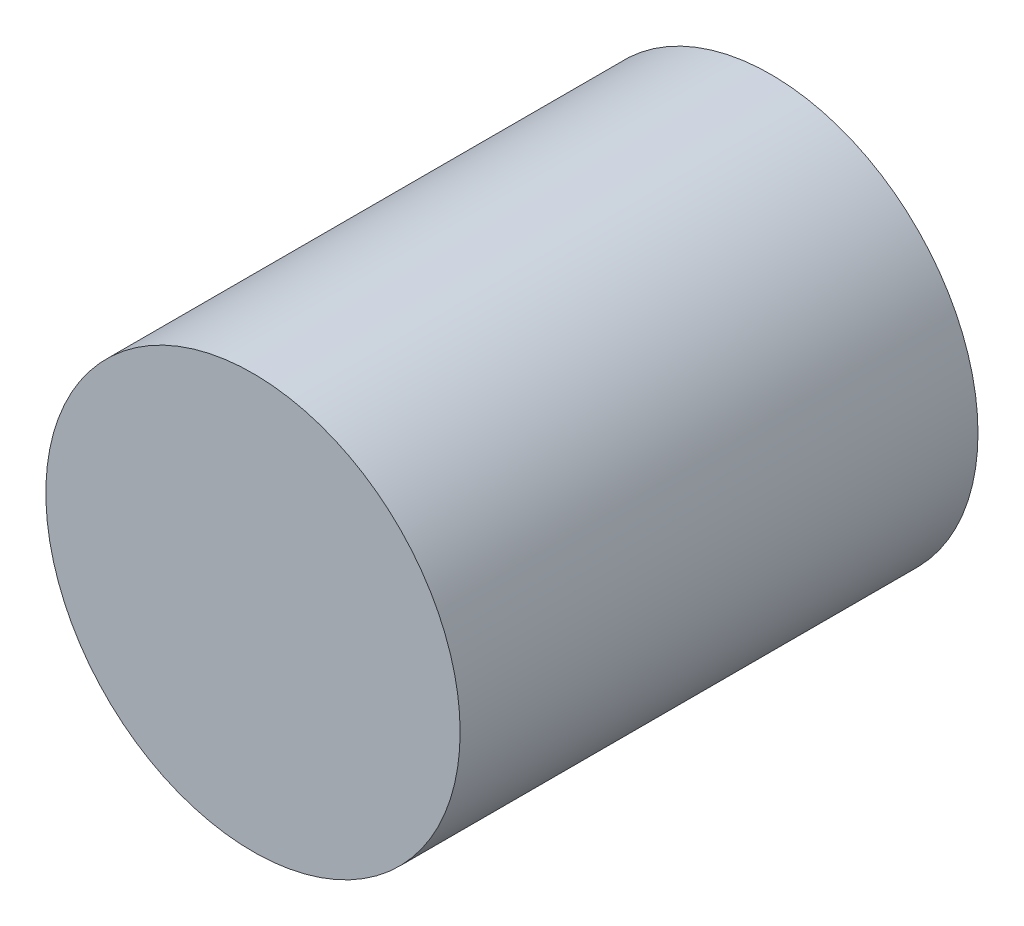
ISO-10303-21;
HEADER;
FILE_DESCRIPTION(('STEP AP214'),'2;1');
FILE_NAME('part.step','',(''),(''),'','','');
FILE_SCHEMA(('AUTOMOTIVE_DESIGN { 1 0 10303 214 1 1 1 1 }'));
ENDSEC;
DATA;
#1=APPLICATION_CONTEXT('core data for automotive mechanical design processes');
#2=APPLICATION_PROTOCOL_DEFINITION('international standard','automotive_design',2000,#1);
#3=PRODUCT_CONTEXT('',#1,'mechanical');
#4=PRODUCT('Part','Part','',(#3));
#5=PRODUCT_RELATED_PRODUCT_CATEGORY('part','',(#4));
#6=PRODUCT_DEFINITION_FORMATION('','',#4);
#7=PRODUCT_DEFINITION_CONTEXT('part definition',#1,'design');
#8=PRODUCT_DEFINITION('design','',#6,#7);
#9=PRODUCT_DEFINITION_SHAPE('','',#8);
#10=(LENGTH_UNIT() NAMED_UNIT(*) SI_UNIT(.MILLI.,.METRE.));
#11=(NAMED_UNIT(*) PLANE_ANGLE_UNIT() SI_UNIT($,.RADIAN.));
#12=(NAMED_UNIT(*) SI_UNIT($,.STERADIAN.) SOLID_ANGLE_UNIT());
#13=UNCERTAINTY_MEASURE_WITH_UNIT(LENGTH_MEASURE(1.E-05),#10,'distance_accuracy_value','');
#14=(GEOMETRIC_REPRESENTATION_CONTEXT(3) GLOBAL_UNCERTAINTY_ASSIGNED_CONTEXT((#13)) GLOBAL_UNIT_ASSIGNED_CONTEXT((#10,
#11,#12)) REPRESENTATION_CONTEXT('',''));
#15=CARTESIAN_POINT('',(0.,0.,0.));
#16=DIRECTION('',(0.,0.,1.));
#17=DIRECTION('',(1.,0.,0.));
#18=AXIS2_PLACEMENT_3D('',#15,#16,#17);
#19=CARTESIAN_POINT('',(0.,0.,50.));
#20=DIRECTION('',(0.,0.,-1.));
#21=DIRECTION('',(-1.,0.,0.));
#22=AXIS2_PLACEMENT_3D('',#19,#20,#21);
#23=CYLINDRICAL_SURFACE('',#22,20.);
#24=CARTESIAN_POINT('',(0.,0.,50.));
#25=DIRECTION('',(0.,0.,1.));
#26=DIRECTION('',(1.,0.,0.));
#27=AXIS2_PLACEMENT_3D('',#24,#25,#26);
#28=CIRCLE('',#27,20.);
#29=CARTESIAN_POINT('',(20.,0.,50.));
#30=VERTEX_POINT('',#29);
#31=EDGE_CURVE('E10',#30,#30,#28,.T.);
#32=ORIENTED_EDGE('',*,*,#31,.F.);
#33=EDGE_LOOP('',(#32));
#34=FACE_BOUND('',#33,.T.);
#35=CARTESIAN_POINT('',(0.,0.,0.));
#36=DIRECTION('',(0.,0.,1.));
#37=DIRECTION('',(1.,0.,0.));
#38=AXIS2_PLACEMENT_3D('',#35,#36,#37);
#39=CIRCLE('',#38,20.);
#40=CARTESIAN_POINT('',(20.,0.,0.));
#41=VERTEX_POINT('',#40);
#42=EDGE_CURVE('E40',#41,#41,#39,.T.);
#43=ORIENTED_EDGE('',*,*,#42,.T.);
#44=EDGE_LOOP('',(#43));
#45=FACE_BOUND('',#44,.T.);
#46=ADVANCED_FACE('F37',(#34,#45),#23,.T.);
#47=CARTESIAN_POINT('',(0.,0.,50.));
#48=DIRECTION('',(0.,0.,1.));
#49=DIRECTION('',(1.,0.,0.));
#50=AXIS2_PLACEMENT_3D('',#47,#48,#49);
#51=PLANE('',#50);
#52=ORIENTED_EDGE('',*,*,#31,.T.);
#53=EDGE_LOOP('',(#52));
#54=FACE_BOUND('',#53,.T.);
#55=ADVANCED_FACE('F54',(#54),#51,.T.);
#56=CARTESIAN_POINT('',(0.,0.,0.));
#57=DIRECTION('',(0.,0.,1.));
#58=DIRECTION('',(1.,0.,0.));
#59=AXIS2_PLACEMENT_3D('',#56,#57,#58);
#60=PLANE('',#59);
#61=ORIENTED_EDGE('',*,*,#42,.F.);
#62=EDGE_LOOP('',(#61));
#63=FACE_BOUND('',#62,.T.);
#64=ADVANCED_FACE('F52',(#63),#60,.F.);
#65=CLOSED_SHELL('',(#46,#55,#64));
#66=MANIFOLD_SOLID_BREP('B2',#65);
#67=ADVANCED_BREP_SHAPE_REPRESENTATION('',(#18,#66),#14);
#68=SHAPE_DEFINITION_REPRESENTATION(#9,#67);
ENDSEC;
END-ISO-10303-21;
